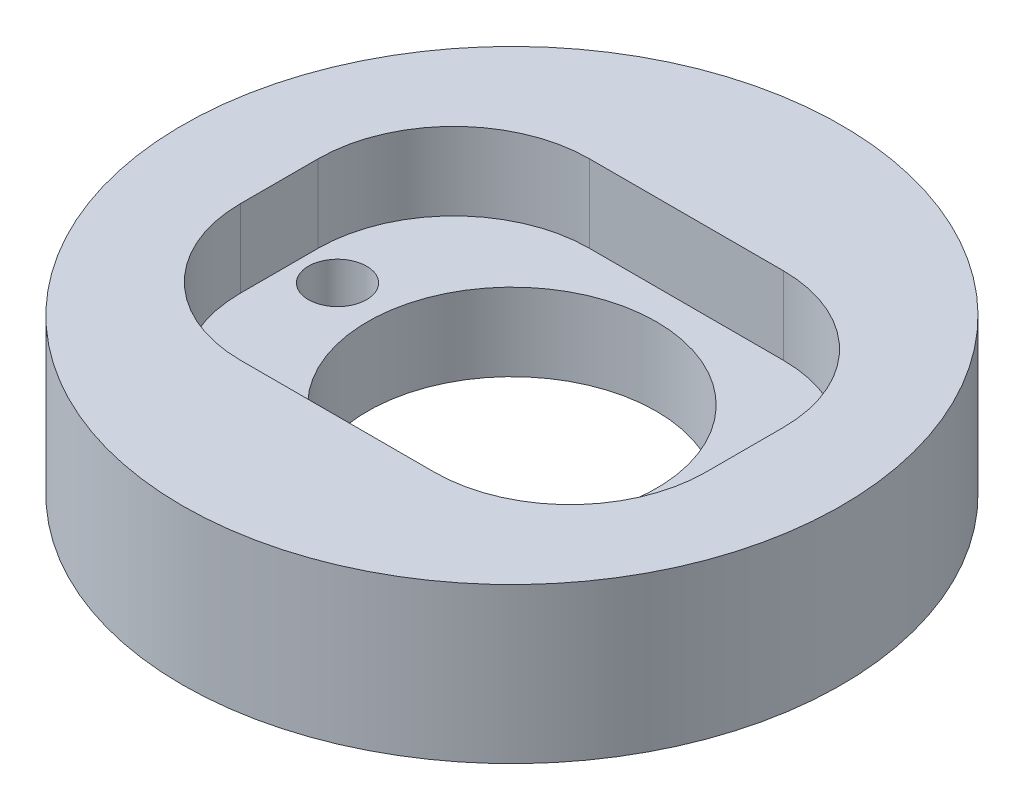
ISO-10303-21;
HEADER;
FILE_DESCRIPTION(('STEP AP214'),'2;1');
FILE_NAME('part.step','',(''),(''),'','','');
FILE_SCHEMA(('AUTOMOTIVE_DESIGN { 1 0 10303 214 1 1 1 1 }'));
ENDSEC;
DATA;
#1=APPLICATION_CONTEXT('core data for automotive mechanical design processes');
#2=APPLICATION_PROTOCOL_DEFINITION('international standard','automotive_design',2000,#1);
#3=PRODUCT_CONTEXT('',#1,'mechanical');
#4=PRODUCT('Part','Part','',(#3));
#5=PRODUCT_RELATED_PRODUCT_CATEGORY('part','',(#4));
#6=PRODUCT_DEFINITION_FORMATION('','',#4);
#7=PRODUCT_DEFINITION_CONTEXT('part definition',#1,'design');
#8=PRODUCT_DEFINITION('design','',#6,#7);
#9=PRODUCT_DEFINITION_SHAPE('','',#8);
#10=(LENGTH_UNIT() NAMED_UNIT(*) SI_UNIT(.MILLI.,.METRE.));
#11=(NAMED_UNIT(*) PLANE_ANGLE_UNIT() SI_UNIT($,.RADIAN.));
#12=(NAMED_UNIT(*) SI_UNIT($,.STERADIAN.) SOLID_ANGLE_UNIT());
#13=UNCERTAINTY_MEASURE_WITH_UNIT(LENGTH_MEASURE(1.E-05),#10,'distance_accuracy_value','');
#14=(GEOMETRIC_REPRESENTATION_CONTEXT(3) GLOBAL_UNCERTAINTY_ASSIGNED_CONTEXT((#13)) GLOBAL_UNIT_ASSIGNED_CONTEXT((#10,
#11,#12)) REPRESENTATION_CONTEXT('',''));
#15=CARTESIAN_POINT('',(0.,0.,0.));
#16=DIRECTION('',(0.,0.,1.));
#17=DIRECTION('',(1.,0.,0.));
#18=AXIS2_PLACEMENT_3D('',#15,#16,#17);
#19=CARTESIAN_POINT('',(0.,4.,0.));
#20=DIRECTION('',(0.,-1.,0.));
#21=DIRECTION('',(0.,0.,-1.));
#22=AXIS2_PLACEMENT_3D('',#19,#20,#21);
#23=CYLINDRICAL_SURFACE('',#22,8.5);
#24=CARTESIAN_POINT('',(0.,4.,0.));
#25=DIRECTION('',(0.,1.,0.));
#26=DIRECTION('',(0.,0.,1.));
#27=AXIS2_PLACEMENT_3D('',#24,#25,#26);
#28=CIRCLE('',#27,8.5);
#29=CARTESIAN_POINT('',(0.,4.,8.5));
#30=VERTEX_POINT('',#29);
#31=EDGE_CURVE('E135',#30,#30,#28,.T.);
#32=ORIENTED_EDGE('',*,*,#31,.F.);
#33=EDGE_LOOP('',(#32));
#34=FACE_BOUND('',#33,.T.);
#35=CARTESIAN_POINT('',(0.,0.,0.));
#36=DIRECTION('',(0.,1.,0.));
#37=DIRECTION('',(0.,0.,1.));
#38=AXIS2_PLACEMENT_3D('',#35,#36,#37);
#39=CIRCLE('',#38,8.5);
#40=CARTESIAN_POINT('',(0.,0.,8.5));
#41=VERTEX_POINT('',#40);
#42=EDGE_CURVE('E138',#41,#41,#39,.T.);
#43=ORIENTED_EDGE('',*,*,#42,.T.);
#44=EDGE_LOOP('',(#43));
#45=FACE_BOUND('',#44,.T.);
#46=ADVANCED_FACE('F36',(#34,#45),#23,.T.);
#47=CARTESIAN_POINT('',(0.,4.,0.));
#48=DIRECTION('',(0.,1.,0.));
#49=DIRECTION('',(0.,0.,1.));
#50=AXIS2_PLACEMENT_3D('',#47,#48,#49);
#51=PLANE('',#50);
#52=DIRECTION('',(0.,0.,-1.));
#53=VECTOR('',#52,1.);
#54=CARTESIAN_POINT('',(6.,4.,-4.5));
#55=LINE('',#54,#53);
#56=CARTESIAN_POINT('',(6.,4.,0.999999999999999));
#57=VERTEX_POINT('',#56);
#58=CARTESIAN_POINT('',(6.,4.,-0.999999999999999));
#59=VERTEX_POINT('',#58);
#60=EDGE_CURVE('E182',#57,#59,#55,.T.);
#61=ORIENTED_EDGE('',*,*,#60,.F.);
#62=CARTESIAN_POINT('',(2.5,4.,1.));
#63=DIRECTION('',(0.,1.,0.));
#64=DIRECTION('',(0.,0.,1.));
#65=AXIS2_PLACEMENT_3D('',#62,#63,#64);
#66=CIRCLE('',#65,3.5);
#67=CARTESIAN_POINT('',(2.5,4.,4.5));
#68=VERTEX_POINT('',#67);
#69=EDGE_CURVE('E108',#57,#68,#66,.F.);
#70=ORIENTED_EDGE('',*,*,#69,.T.);
#71=DIRECTION('',(1.,0.,0.));
#72=VECTOR('',#71,1.);
#73=CARTESIAN_POINT('',(-6.,4.,4.5));
#74=LINE('',#73,#72);
#75=CARTESIAN_POINT('',(-2.5,4.,4.5));
#76=VERTEX_POINT('',#75);
#77=EDGE_CURVE('E115',#76,#68,#74,.T.);
#78=ORIENTED_EDGE('',*,*,#77,.F.);
#79=CARTESIAN_POINT('',(-2.5,4.,1.));
#80=DIRECTION('',(0.,1.,0.));
#81=DIRECTION('',(0.,0.,1.));
#82=AXIS2_PLACEMENT_3D('',#79,#80,#81);
#83=CIRCLE('',#82,3.5);
#84=CARTESIAN_POINT('',(-6.,4.,1.));
#85=VERTEX_POINT('',#84);
#86=EDGE_CURVE('E100',#76,#85,#83,.F.);
#87=ORIENTED_EDGE('',*,*,#86,.T.);
#88=DIRECTION('',(0.,0.,1.));
#89=VECTOR('',#88,1.);
#90=CARTESIAN_POINT('',(-6.,4.,-4.5));
#91=LINE('',#90,#89);
#92=CARTESIAN_POINT('',(-6.,4.,-0.999999999999998));
#93=VERTEX_POINT('',#92);
#94=EDGE_CURVE('E126',#93,#85,#91,.T.);
#95=ORIENTED_EDGE('',*,*,#94,.F.);
#96=CARTESIAN_POINT('',(-2.5,4.,-0.999999999999999));
#97=DIRECTION('',(0.,1.,0.));
#98=DIRECTION('',(0.,0.,1.));
#99=AXIS2_PLACEMENT_3D('',#96,#97,#98);
#100=CIRCLE('',#99,3.5);
#101=CARTESIAN_POINT('',(-2.5,4.,-4.5));
#102=VERTEX_POINT('',#101);
#103=EDGE_CURVE('E44',#93,#102,#100,.F.);
#104=ORIENTED_EDGE('',*,*,#103,.T.);
#105=DIRECTION('',(-1.,0.,0.));
#106=VECTOR('',#105,1.);
#107=CARTESIAN_POINT('',(-6.,4.,-4.5));
#108=LINE('',#107,#106);
#109=CARTESIAN_POINT('',(2.5,4.,-4.5));
#110=VERTEX_POINT('',#109);
#111=EDGE_CURVE('E131',#110,#102,#108,.T.);
#112=ORIENTED_EDGE('',*,*,#111,.F.);
#113=CARTESIAN_POINT('',(2.5,4.,-0.999999999999999));
#114=DIRECTION('',(0.,1.,0.));
#115=DIRECTION('',(0.,0.,1.));
#116=AXIS2_PLACEMENT_3D('',#113,#114,#115);
#117=CIRCLE('',#116,3.5);
#118=EDGE_CURVE('E11',#110,#59,#117,.F.);
#119=ORIENTED_EDGE('',*,*,#118,.T.);
#120=EDGE_LOOP('',(#61,#70,#78,#87,#95,#104,#112,#119));
#121=FACE_BOUND('',#120,.T.);
#122=ORIENTED_EDGE('',*,*,#31,.T.);
#123=EDGE_LOOP('',(#122));
#124=FACE_BOUND('',#123,.T.);
#125=ADVANCED_FACE('F123',(#121,#124),#51,.T.);
#126=CARTESIAN_POINT('',(0.,0.,0.));
#127=DIRECTION('',(0.,1.,0.));
#128=DIRECTION('',(0.,0.,1.));
#129=AXIS2_PLACEMENT_3D('',#126,#127,#128);
#130=PLANE('',#129);
#131=CARTESIAN_POINT('',(-4.9770451455014,0.,-0.47856203322129));
#132=DIRECTION('',(0.,1.,0.));
#133=DIRECTION('',(0.,0.,1.));
#134=AXIS2_PLACEMENT_3D('',#131,#132,#133);
#135=CIRCLE('',#134,0.750000000000001);
#136=CARTESIAN_POINT('',(-4.9770451455014,0.,0.271437966778711));
#137=VERTEX_POINT('',#136);
#138=EDGE_CURVE('E198',#137,#137,#135,.T.);
#139=ORIENTED_EDGE('',*,*,#138,.T.);
#140=EDGE_LOOP('',(#139));
#141=FACE_BOUND('',#140,.T.);
#142=CARTESIAN_POINT('',(4.9770451455014,0.,-0.478562033221291));
#143=DIRECTION('',(0.,1.,0.));
#144=DIRECTION('',(0.,0.,-1.));
#145=AXIS2_PLACEMENT_3D('',#142,#143,#144);
#146=CIRCLE('',#145,0.750000000000001);
#147=CARTESIAN_POINT('',(4.9770451455014,0.,-1.22856203322129));
#148=VERTEX_POINT('',#147);
#149=EDGE_CURVE('E192',#148,#148,#146,.T.);
#150=ORIENTED_EDGE('',*,*,#149,.T.);
#151=EDGE_LOOP('',(#150));
#152=FACE_BOUND('',#151,.T.);
#153=CARTESIAN_POINT('',(0.,0.,0.));
#154=DIRECTION('',(0.,1.,0.));
#155=DIRECTION('',(0.,0.,1.));
#156=AXIS2_PLACEMENT_3D('',#153,#154,#155);
#157=CIRCLE('',#156,3.725);
#158=CARTESIAN_POINT('',(0.,0.,3.725));
#159=VERTEX_POINT('',#158);
#160=EDGE_CURVE('E184',#159,#159,#157,.T.);
#161=ORIENTED_EDGE('',*,*,#160,.T.);
#162=EDGE_LOOP('',(#161));
#163=FACE_BOUND('',#162,.T.);
#164=ORIENTED_EDGE('',*,*,#42,.F.);
#165=EDGE_LOOP('',(#164));
#166=FACE_BOUND('',#165,.T.);
#167=ADVANCED_FACE('F207',(#141,#152,#163,#166),#130,.F.);
#168=CARTESIAN_POINT('',(6.,2.,-4.5));
#169=DIRECTION('',(1.,0.,0.));
#170=DIRECTION('',(0.,0.,-1.));
#171=AXIS2_PLACEMENT_3D('',#168,#169,#170);
#172=PLANE('',#171);
#173=DIRECTION('',(0.,0.,-1.));
#174=VECTOR('',#173,1.);
#175=CARTESIAN_POINT('',(6.,2.,-4.5));
#176=LINE('',#175,#174);
#177=CARTESIAN_POINT('',(6.,2.,0.999999999999999));
#178=VERTEX_POINT('',#177);
#179=CARTESIAN_POINT('',(6.,2.,-0.999999999999999));
#180=VERTEX_POINT('',#179);
#181=EDGE_CURVE('E125',#178,#180,#176,.T.);
#182=ORIENTED_EDGE('',*,*,#181,.F.);
#183=DIRECTION('',(0.,1.,0.));
#184=VECTOR('',#183,1.);
#185=CARTESIAN_POINT('',(6.,4.,0.999999999999999));
#186=LINE('',#185,#184);
#187=EDGE_CURVE('E155',#178,#57,#186,.T.);
#188=ORIENTED_EDGE('',*,*,#187,.T.);
#189=ORIENTED_EDGE('',*,*,#60,.T.);
#190=DIRECTION('',(0.,1.,0.));
#191=VECTOR('',#190,1.);
#192=CARTESIAN_POINT('',(6.,2.,-0.999999999999999));
#193=LINE('',#192,#191);
#194=EDGE_CURVE('E153',#59,#180,#193,.F.);
#195=ORIENTED_EDGE('',*,*,#194,.T.);
#196=EDGE_LOOP('',(#182,#188,#189,#195));
#197=FACE_BOUND('',#196,.T.);
#198=ADVANCED_FACE('F250',(#197),#172,.F.);
#199=CARTESIAN_POINT('',(-6.,2.,4.5));
#200=DIRECTION('',(0.,0.,1.));
#201=DIRECTION('',(1.,0.,0.));
#202=AXIS2_PLACEMENT_3D('',#199,#200,#201);
#203=PLANE('',#202);
#204=DIRECTION('',(1.,0.,0.));
#205=VECTOR('',#204,1.);
#206=CARTESIAN_POINT('',(-6.,2.,4.5));
#207=LINE('',#206,#205);
#208=CARTESIAN_POINT('',(-2.5,2.,4.5));
#209=VERTEX_POINT('',#208);
#210=CARTESIAN_POINT('',(2.5,2.,4.5));
#211=VERTEX_POINT('',#210);
#212=EDGE_CURVE('E118',#209,#211,#207,.T.);
#213=ORIENTED_EDGE('',*,*,#212,.F.);
#214=DIRECTION('',(0.,1.,0.));
#215=VECTOR('',#214,1.);
#216=CARTESIAN_POINT('',(-2.5,4.,4.5));
#217=LINE('',#216,#215);
#218=EDGE_CURVE('E104',#209,#76,#217,.T.);
#219=ORIENTED_EDGE('',*,*,#218,.T.);
#220=ORIENTED_EDGE('',*,*,#77,.T.);
#221=DIRECTION('',(0.,1.,0.));
#222=VECTOR('',#221,1.);
#223=CARTESIAN_POINT('',(2.5,2.,4.5));
#224=LINE('',#223,#222);
#225=EDGE_CURVE('E120',#68,#211,#224,.F.);
#226=ORIENTED_EDGE('',*,*,#225,.T.);
#227=EDGE_LOOP('',(#213,#219,#220,#226));
#228=FACE_BOUND('',#227,.T.);
#229=ADVANCED_FACE('F114',(#228),#203,.F.);
#230=CARTESIAN_POINT('',(-6.,2.,-4.5));
#231=DIRECTION('',(-1.,0.,0.));
#232=DIRECTION('',(0.,0.,1.));
#233=AXIS2_PLACEMENT_3D('',#230,#231,#232);
#234=PLANE('',#233);
#235=ORIENTED_EDGE('',*,*,#94,.T.);
#236=DIRECTION('',(0.,1.,0.));
#237=VECTOR('',#236,1.);
#238=CARTESIAN_POINT('',(-6.,2.,1.));
#239=LINE('',#238,#237);
#240=CARTESIAN_POINT('',(-6.,2.,1.));
#241=VERTEX_POINT('',#240);
#242=EDGE_CURVE('E105',#85,#241,#239,.F.);
#243=ORIENTED_EDGE('',*,*,#242,.T.);
#244=DIRECTION('',(0.,0.,1.));
#245=VECTOR('',#244,1.);
#246=CARTESIAN_POINT('',(-6.,2.,-4.5));
#247=LINE('',#246,#245);
#248=CARTESIAN_POINT('',(-6.,2.,-0.999999999999998));
#249=VERTEX_POINT('',#248);
#250=EDGE_CURVE('E173',#249,#241,#247,.T.);
#251=ORIENTED_EDGE('',*,*,#250,.F.);
#252=DIRECTION('',(0.,1.,0.));
#253=VECTOR('',#252,1.);
#254=CARTESIAN_POINT('',(-6.,4.,-0.999999999999998));
#255=LINE('',#254,#253);
#256=EDGE_CURVE('E119',#249,#93,#255,.T.);
#257=ORIENTED_EDGE('',*,*,#256,.T.);
#258=EDGE_LOOP('',(#235,#243,#251,#257));
#259=FACE_BOUND('',#258,.T.);
#260=ADVANCED_FACE('F178',(#259),#234,.F.);
#261=CARTESIAN_POINT('',(-6.,2.,-4.5));
#262=DIRECTION('',(0.,0.,-1.));
#263=DIRECTION('',(-1.,0.,0.));
#264=AXIS2_PLACEMENT_3D('',#261,#262,#263);
#265=PLANE('',#264);
#266=ORIENTED_EDGE('',*,*,#111,.T.);
#267=DIRECTION('',(0.,1.,0.));
#268=VECTOR('',#267,1.);
#269=CARTESIAN_POINT('',(-2.5,2.,-4.5));
#270=LINE('',#269,#268);
#271=CARTESIAN_POINT('',(-2.5,2.,-4.5));
#272=VERTEX_POINT('',#271);
#273=EDGE_CURVE('E109',#102,#272,#270,.F.);
#274=ORIENTED_EDGE('',*,*,#273,.T.);
#275=DIRECTION('',(-1.,0.,0.));
#276=VECTOR('',#275,1.);
#277=CARTESIAN_POINT('',(-6.,2.,-4.5));
#278=LINE('',#277,#276);
#279=CARTESIAN_POINT('',(2.5,2.,-4.5));
#280=VERTEX_POINT('',#279);
#281=EDGE_CURVE('E129',#280,#272,#278,.T.);
#282=ORIENTED_EDGE('',*,*,#281,.F.);
#283=DIRECTION('',(0.,1.,0.));
#284=VECTOR('',#283,1.);
#285=CARTESIAN_POINT('',(2.5,4.,-4.5));
#286=LINE('',#285,#284);
#287=EDGE_CURVE('E158',#280,#110,#286,.T.);
#288=ORIENTED_EDGE('',*,*,#287,.T.);
#289=EDGE_LOOP('',(#266,#274,#282,#288));
#290=FACE_BOUND('',#289,.T.);
#291=ADVANCED_FACE('F165',(#290),#265,.F.);
#292=CARTESIAN_POINT('',(0.,2.,0.));
#293=DIRECTION('',(0.,1.,0.));
#294=DIRECTION('',(0.,0.,1.));
#295=AXIS2_PLACEMENT_3D('',#292,#293,#294);
#296=PLANE('',#295);
#297=CARTESIAN_POINT('',(0.,2.,0.));
#298=DIRECTION('',(0.,1.,0.));
#299=DIRECTION('',(0.,0.,1.));
#300=AXIS2_PLACEMENT_3D('',#297,#298,#299);
#301=CIRCLE('',#300,3.725);
#302=CARTESIAN_POINT('',(0.,2.,3.725));
#303=VERTEX_POINT('',#302);
#304=EDGE_CURVE('E187',#303,#303,#301,.T.);
#305=ORIENTED_EDGE('',*,*,#304,.F.);
#306=EDGE_LOOP('',(#305));
#307=FACE_BOUND('',#306,.T.);
#308=CARTESIAN_POINT('',(-4.9770451455014,2.,-0.47856203322129));
#309=DIRECTION('',(0.,1.,0.));
#310=DIRECTION('',(0.,0.,1.));
#311=AXIS2_PLACEMENT_3D('',#308,#309,#310);
#312=CIRCLE('',#311,0.750000000000001);
#313=CARTESIAN_POINT('',(-4.9770451455014,2.,0.271437966778711));
#314=VERTEX_POINT('',#313);
#315=EDGE_CURVE('E195',#314,#314,#312,.T.);
#316=ORIENTED_EDGE('',*,*,#315,.F.);
#317=EDGE_LOOP('',(#316));
#318=FACE_BOUND('',#317,.T.);
#319=CARTESIAN_POINT('',(4.9770451455014,2.,-0.478562033221291));
#320=DIRECTION('',(0.,1.,0.));
#321=DIRECTION('',(0.,0.,-1.));
#322=AXIS2_PLACEMENT_3D('',#319,#320,#321);
#323=CIRCLE('',#322,0.750000000000001);
#324=CARTESIAN_POINT('',(4.9770451455014,2.,-1.22856203322129));
#325=VERTEX_POINT('',#324);
#326=EDGE_CURVE('E201',#325,#325,#323,.T.);
#327=ORIENTED_EDGE('',*,*,#326,.F.);
#328=EDGE_LOOP('',(#327));
#329=FACE_BOUND('',#328,.T.);
#330=ORIENTED_EDGE('',*,*,#250,.T.);
#331=CARTESIAN_POINT('',(-2.5,2.,1.));
#332=DIRECTION('',(0.,1.,0.));
#333=DIRECTION('',(0.,0.,1.));
#334=AXIS2_PLACEMENT_3D('',#331,#332,#333);
#335=CIRCLE('',#334,3.5);
#336=EDGE_CURVE('E151',#241,#209,#335,.T.);
#337=ORIENTED_EDGE('',*,*,#336,.T.);
#338=ORIENTED_EDGE('',*,*,#212,.T.);
#339=CARTESIAN_POINT('',(2.5,2.,1.));
#340=DIRECTION('',(0.,1.,0.));
#341=DIRECTION('',(0.,0.,1.));
#342=AXIS2_PLACEMENT_3D('',#339,#340,#341);
#343=CIRCLE('',#342,3.5);
#344=EDGE_CURVE('E149',#211,#178,#343,.T.);
#345=ORIENTED_EDGE('',*,*,#344,.T.);
#346=ORIENTED_EDGE('',*,*,#181,.T.);
#347=CARTESIAN_POINT('',(2.5,2.,-0.999999999999999));
#348=DIRECTION('',(0.,1.,0.));
#349=DIRECTION('',(0.,0.,1.));
#350=AXIS2_PLACEMENT_3D('',#347,#348,#349);
#351=CIRCLE('',#350,3.5);
#352=EDGE_CURVE('E145',#180,#280,#351,.T.);
#353=ORIENTED_EDGE('',*,*,#352,.T.);
#354=ORIENTED_EDGE('',*,*,#281,.T.);
#355=CARTESIAN_POINT('',(-2.5,2.,-0.999999999999999));
#356=DIRECTION('',(0.,1.,0.));
#357=DIRECTION('',(0.,0.,1.));
#358=AXIS2_PLACEMENT_3D('',#355,#356,#357);
#359=CIRCLE('',#358,3.5);
#360=EDGE_CURVE('E147',#272,#249,#359,.T.);
#361=ORIENTED_EDGE('',*,*,#360,.T.);
#362=EDGE_LOOP('',(#330,#337,#338,#345,#346,#353,#354,#361));
#363=FACE_BOUND('',#362,.T.);
#364=ADVANCED_FACE('F170',(#307,#318,#329,#363),#296,.T.);
#365=CARTESIAN_POINT('',(-2.5,2.,1.));
#366=DIRECTION('',(0.,-1.,0.));
#367=DIRECTION('',(0.,0.,-1.));
#368=AXIS2_PLACEMENT_3D('',#365,#366,#367);
#369=CYLINDRICAL_SURFACE('',#368,3.5);
#370=ORIENTED_EDGE('',*,*,#336,.F.);
#371=ORIENTED_EDGE('',*,*,#242,.F.);
#372=ORIENTED_EDGE('',*,*,#86,.F.);
#373=ORIENTED_EDGE('',*,*,#218,.F.);
#374=EDGE_LOOP('',(#370,#371,#372,#373));
#375=FACE_BOUND('',#374,.T.);
#376=ADVANCED_FACE('F103',(#375),#369,.F.);
#377=CARTESIAN_POINT('',(2.5,2.,1.));
#378=DIRECTION('',(0.,-1.,0.));
#379=DIRECTION('',(0.,0.,-1.));
#380=AXIS2_PLACEMENT_3D('',#377,#378,#379);
#381=CYLINDRICAL_SURFACE('',#380,3.5);
#382=ORIENTED_EDGE('',*,*,#344,.F.);
#383=ORIENTED_EDGE('',*,*,#225,.F.);
#384=ORIENTED_EDGE('',*,*,#69,.F.);
#385=ORIENTED_EDGE('',*,*,#187,.F.);
#386=EDGE_LOOP('',(#382,#383,#384,#385));
#387=FACE_BOUND('',#386,.T.);
#388=ADVANCED_FACE('F223',(#387),#381,.F.);
#389=CARTESIAN_POINT('',(-2.5,2.,-0.999999999999999));
#390=DIRECTION('',(0.,-1.,0.));
#391=DIRECTION('',(0.,0.,-1.));
#392=AXIS2_PLACEMENT_3D('',#389,#390,#391);
#393=CYLINDRICAL_SURFACE('',#392,3.5);
#394=ORIENTED_EDGE('',*,*,#360,.F.);
#395=ORIENTED_EDGE('',*,*,#273,.F.);
#396=ORIENTED_EDGE('',*,*,#103,.F.);
#397=ORIENTED_EDGE('',*,*,#256,.F.);
#398=EDGE_LOOP('',(#394,#395,#396,#397));
#399=FACE_BOUND('',#398,.T.);
#400=ADVANCED_FACE('F176',(#399),#393,.F.);
#401=CARTESIAN_POINT('',(2.5,2.,-0.999999999999999));
#402=DIRECTION('',(0.,-1.,0.));
#403=DIRECTION('',(0.,0.,-1.));
#404=AXIS2_PLACEMENT_3D('',#401,#402,#403);
#405=CYLINDRICAL_SURFACE('',#404,3.5);
#406=ORIENTED_EDGE('',*,*,#352,.F.);
#407=ORIENTED_EDGE('',*,*,#194,.F.);
#408=ORIENTED_EDGE('',*,*,#118,.F.);
#409=ORIENTED_EDGE('',*,*,#287,.F.);
#410=EDGE_LOOP('',(#406,#407,#408,#409));
#411=FACE_BOUND('',#410,.T.);
#412=ADVANCED_FACE('F38',(#411),#405,.F.);
#413=CARTESIAN_POINT('',(4.9770451455014,0.,-0.478562033221291));
#414=DIRECTION('',(0.,1.,0.));
#415=DIRECTION('',(0.,0.,1.));
#416=AXIS2_PLACEMENT_3D('',#413,#414,#415);
#417=CYLINDRICAL_SURFACE('',#416,0.750000000000001);
#418=ORIENTED_EDGE('',*,*,#149,.F.);
#419=EDGE_LOOP('',(#418));
#420=FACE_BOUND('',#419,.T.);
#421=ORIENTED_EDGE('',*,*,#326,.T.);
#422=EDGE_LOOP('',(#421));
#423=FACE_BOUND('',#422,.T.);
#424=ADVANCED_FACE('F209',(#420,#423),#417,.F.);
#425=CARTESIAN_POINT('',(-4.9770451455014,0.,-0.47856203322129));
#426=DIRECTION('',(0.,1.,0.));
#427=DIRECTION('',(0.,0.,1.));
#428=AXIS2_PLACEMENT_3D('',#425,#426,#427);
#429=CYLINDRICAL_SURFACE('',#428,0.750000000000001);
#430=ORIENTED_EDGE('',*,*,#138,.F.);
#431=EDGE_LOOP('',(#430));
#432=FACE_BOUND('',#431,.T.);
#433=ORIENTED_EDGE('',*,*,#315,.T.);
#434=EDGE_LOOP('',(#433));
#435=FACE_BOUND('',#434,.T.);
#436=ADVANCED_FACE('F212',(#432,#435),#429,.F.);
#437=CARTESIAN_POINT('',(0.,0.,0.));
#438=DIRECTION('',(0.,1.,0.));
#439=DIRECTION('',(0.,0.,1.));
#440=AXIS2_PLACEMENT_3D('',#437,#438,#439);
#441=CYLINDRICAL_SURFACE('',#440,3.725);
#442=ORIENTED_EDGE('',*,*,#160,.F.);
#443=EDGE_LOOP('',(#442));
#444=FACE_BOUND('',#443,.T.);
#445=ORIENTED_EDGE('',*,*,#304,.T.);
#446=EDGE_LOOP('',(#445));
#447=FACE_BOUND('',#446,.T.);
#448=ADVANCED_FACE('F317',(#444,#447),#441,.F.);
#449=CLOSED_SHELL('',(#46,#125,#167,#198,#229,#260,#291,#364,#376,#388,#400,#412,#424,#436,#448));
#450=MANIFOLD_SOLID_BREP('B2',#449);
#451=ADVANCED_BREP_SHAPE_REPRESENTATION('',(#18,#450),#14);
#452=SHAPE_DEFINITION_REPRESENTATION(#9,#451);
ENDSEC;
END-ISO-10303-21;
